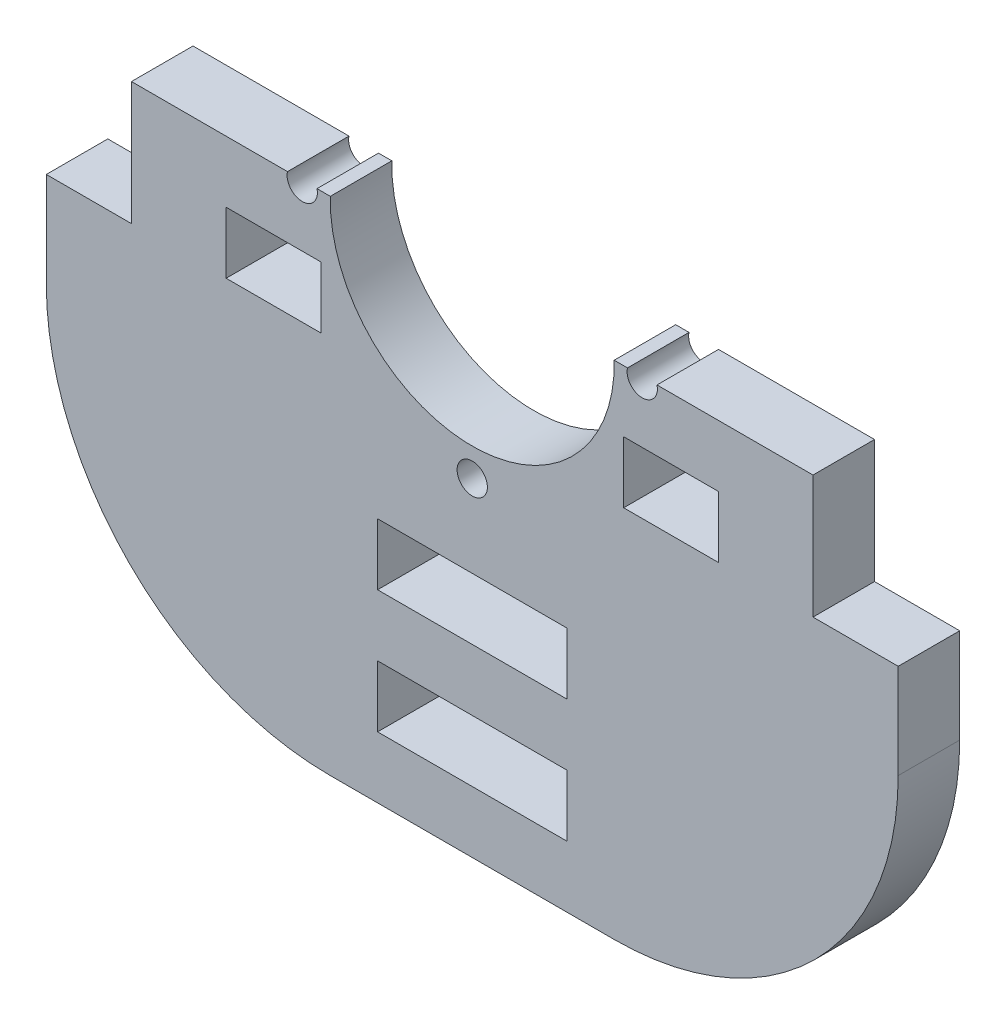
ISO-10303-21;
HEADER;
FILE_DESCRIPTION(('STEP AP214'),'2;1');
FILE_NAME('part.step','',(''),(''),'','','');
FILE_SCHEMA(('AUTOMOTIVE_DESIGN { 1 0 10303 214 1 1 1 1 }'));
ENDSEC;
DATA;
#1=APPLICATION_CONTEXT('core data for automotive mechanical design processes');
#2=APPLICATION_PROTOCOL_DEFINITION('international standard','automotive_design',2000,#1);
#3=PRODUCT_CONTEXT('',#1,'mechanical');
#4=PRODUCT('Part','Part','',(#3));
#5=PRODUCT_RELATED_PRODUCT_CATEGORY('part','',(#4));
#6=PRODUCT_DEFINITION_FORMATION('','',#4);
#7=PRODUCT_DEFINITION_CONTEXT('part definition',#1,'design');
#8=PRODUCT_DEFINITION('design','',#6,#7);
#9=PRODUCT_DEFINITION_SHAPE('','',#8);
#10=(LENGTH_UNIT() NAMED_UNIT(*) SI_UNIT(.MILLI.,.METRE.));
#11=(NAMED_UNIT(*) PLANE_ANGLE_UNIT() SI_UNIT($,.RADIAN.));
#12=(NAMED_UNIT(*) SI_UNIT($,.STERADIAN.) SOLID_ANGLE_UNIT());
#13=UNCERTAINTY_MEASURE_WITH_UNIT(LENGTH_MEASURE(1.E-05),#10,'distance_accuracy_value','');
#14=(GEOMETRIC_REPRESENTATION_CONTEXT(3) GLOBAL_UNCERTAINTY_ASSIGNED_CONTEXT((#13)) GLOBAL_UNIT_ASSIGNED_CONTEXT((#10,
#11,#12)) REPRESENTATION_CONTEXT('',''));
#15=CARTESIAN_POINT('',(0.,0.,0.));
#16=DIRECTION('',(0.,0.,1.));
#17=DIRECTION('',(1.,0.,0.));
#18=AXIS2_PLACEMENT_3D('',#15,#16,#17);
#19=CARTESIAN_POINT('',(0.,53.,6.5));
#20=DIRECTION('',(0.,1.,0.));
#21=DIRECTION('',(0.,0.,1.));
#22=AXIS2_PLACEMENT_3D('',#19,#20,#21);
#23=PLANE('',#22);
#24=DIRECTION('',(0.,0.,1.));
#25=VECTOR('',#24,1.);
#26=CARTESIAN_POINT('',(25.4806708667845,53.,0.));
#27=LINE('',#26,#25);
#28=CARTESIAN_POINT('',(25.4806708667845,53.,0.));
#29=VERTEX_POINT('',#28);
#30=CARTESIAN_POINT('',(25.4806708667845,53.,6.5));
#31=VERTEX_POINT('',#30);
#32=EDGE_CURVE('E386',#29,#31,#27,.T.);
#33=ORIENTED_EDGE('',*,*,#32,.F.);
#34=DIRECTION('',(1.,0.,0.));
#35=VECTOR('',#34,1.);
#36=CARTESIAN_POINT('',(0.,53.,0.));
#37=LINE('',#36,#35);
#38=CARTESIAN_POINT('',(9.,53.,0.));
#39=VERTEX_POINT('',#38);
#40=EDGE_CURVE('E442',#39,#29,#37,.T.);
#41=ORIENTED_EDGE('',*,*,#40,.F.);
#42=DIRECTION('',(0.,0.,-1.));
#43=VECTOR('',#42,1.);
#44=CARTESIAN_POINT('',(9.,53.,6.5));
#45=LINE('',#44,#43);
#46=CARTESIAN_POINT('',(9.,53.,6.5));
#47=VERTEX_POINT('',#46);
#48=EDGE_CURVE('E470',#47,#39,#45,.T.);
#49=ORIENTED_EDGE('',*,*,#48,.F.);
#50=DIRECTION('',(1.,0.,0.));
#51=VECTOR('',#50,1.);
#52=CARTESIAN_POINT('',(0.,53.,6.5));
#53=LINE('',#52,#51);
#54=EDGE_CURVE('E421',#47,#31,#53,.T.);
#55=ORIENTED_EDGE('',*,*,#54,.T.);
#56=EDGE_LOOP('',(#33,#41,#49,#55));
#57=FACE_BOUND('',#56,.T.);
#58=ADVANCED_FACE('F44',(#57),#23,.T.);
#59=DIRECTION('',(0.,0.,1.));
#60=VECTOR('',#59,1.);
#61=CARTESIAN_POINT('',(61.4016953510612,53.,0.));
#62=LINE('',#61,#60);
#63=CARTESIAN_POINT('',(61.4016953510612,53.,0.));
#64=VERTEX_POINT('',#63);
#65=CARTESIAN_POINT('',(61.4016953510612,53.,6.5));
#66=VERTEX_POINT('',#65);
#67=EDGE_CURVE('E395',#64,#66,#62,.T.);
#68=ORIENTED_EDGE('',*,*,#67,.F.);
#69=CARTESIAN_POINT('',(59.9956630430237,53.,0.));
#70=VERTEX_POINT('',#69);
#71=EDGE_CURVE('E447',#70,#64,#37,.T.);
#72=ORIENTED_EDGE('',*,*,#71,.F.);
#73=DIRECTION('',(0.,0.,1.));
#74=VECTOR('',#73,1.);
#75=CARTESIAN_POINT('',(59.9956630430237,53.,0.));
#76=LINE('',#75,#74);
#77=CARTESIAN_POINT('',(59.9956630430237,53.,6.5));
#78=VERTEX_POINT('',#77);
#79=EDGE_CURVE('E410',#70,#78,#76,.T.);
#80=ORIENTED_EDGE('',*,*,#79,.T.);
#81=EDGE_CURVE('E426',#78,#66,#53,.T.);
#82=ORIENTED_EDGE('',*,*,#81,.T.);
#83=EDGE_LOOP('',(#68,#72,#80,#82));
#84=FACE_BOUND('',#83,.T.);
#85=ADVANCED_FACE('F549',(#84),#23,.T.);
#86=DIRECTION('',(0.,0.,1.));
#87=VECTOR('',#86,1.);
#88=CARTESIAN_POINT('',(28.5983046489389,53.,0.));
#89=LINE('',#88,#87);
#90=CARTESIAN_POINT('',(28.5983046489389,53.,6.5));
#91=VERTEX_POINT('',#90);
#92=CARTESIAN_POINT('',(28.5983046489389,53.,0.));
#93=VERTEX_POINT('',#92);
#94=EDGE_CURVE('E384',#91,#93,#89,.F.);
#95=ORIENTED_EDGE('',*,*,#94,.F.);
#96=CARTESIAN_POINT('',(30.0043369569763,53.,6.5));
#97=VERTEX_POINT('',#96);
#98=EDGE_CURVE('E425',#91,#97,#53,.T.);
#99=ORIENTED_EDGE('',*,*,#98,.T.);
#100=DIRECTION('',(0.,0.,1.));
#101=VECTOR('',#100,1.);
#102=CARTESIAN_POINT('',(30.0043369569763,53.,0.));
#103=LINE('',#102,#101);
#104=CARTESIAN_POINT('',(30.0043369569763,53.,0.));
#105=VERTEX_POINT('',#104);
#106=EDGE_CURVE('E408',#105,#97,#103,.T.);
#107=ORIENTED_EDGE('',*,*,#106,.F.);
#108=EDGE_CURVE('E446',#93,#105,#37,.T.);
#109=ORIENTED_EDGE('',*,*,#108,.F.);
#110=EDGE_LOOP('',(#95,#99,#107,#109));
#111=FACE_BOUND('',#110,.T.);
#112=ADVANCED_FACE('F540',(#111),#23,.T.);
#113=CARTESIAN_POINT('',(81.0000000000001,1.7293858652815E-13,6.5));
#114=DIRECTION('',(1.,0.,0.));
#115=DIRECTION('',(0.,1.,0.));
#116=AXIS2_PLACEMENT_3D('',#113,#114,#115);
#117=PLANE('',#116);
#118=DIRECTION('',(0.,-1.,0.));
#119=VECTOR('',#118,1.);
#120=CARTESIAN_POINT('',(81.0000000000001,1.7293858652815E-13,0.));
#121=LINE('',#120,#119);
#122=CARTESIAN_POINT('',(81.,53.,0.));
#123=VERTEX_POINT('',#122);
#124=CARTESIAN_POINT('',(81.,40.,0.));
#125=VERTEX_POINT('',#124);
#126=EDGE_CURVE('E413',#123,#125,#121,.T.);
#127=ORIENTED_EDGE('',*,*,#126,.F.);
#128=DIRECTION('',(0.,0.,-1.));
#129=VECTOR('',#128,1.);
#130=CARTESIAN_POINT('',(81.,53.,6.5));
#131=LINE('',#130,#129);
#132=CARTESIAN_POINT('',(81.,53.,6.5));
#133=VERTEX_POINT('',#132);
#134=EDGE_CURVE('E472',#133,#123,#131,.T.);
#135=ORIENTED_EDGE('',*,*,#134,.F.);
#136=DIRECTION('',(0.,-1.,0.));
#137=VECTOR('',#136,1.);
#138=CARTESIAN_POINT('',(81.0000000000001,1.7293858652815E-13,6.5));
#139=LINE('',#138,#137);
#140=CARTESIAN_POINT('',(81.,40.,6.5));
#141=VERTEX_POINT('',#140);
#142=EDGE_CURVE('E416',#133,#141,#139,.T.);
#143=ORIENTED_EDGE('',*,*,#142,.T.);
#144=DIRECTION('',(0.,0.,-1.));
#145=VECTOR('',#144,1.);
#146=CARTESIAN_POINT('',(81.,40.,6.5));
#147=LINE('',#146,#145);
#148=EDGE_CURVE('E460',#141,#125,#147,.T.);
#149=ORIENTED_EDGE('',*,*,#148,.T.);
#150=EDGE_LOOP('',(#127,#135,#143,#149));
#151=FACE_BOUND('',#150,.T.);
#152=ADVANCED_FACE('F530',(#151),#117,.T.);
#153=DIRECTION('',(0.,0.,1.));
#154=VECTOR('',#153,1.);
#155=CARTESIAN_POINT('',(64.5193291332155,53.,0.));
#156=LINE('',#155,#154);
#157=CARTESIAN_POINT('',(64.5193291332155,53.,0.));
#158=VERTEX_POINT('',#157);
#159=CARTESIAN_POINT('',(64.5193291332155,53.,6.5));
#160=VERTEX_POINT('',#159);
#161=EDGE_CURVE('E392',#158,#160,#156,.T.);
#162=ORIENTED_EDGE('',*,*,#161,.T.);
#163=EDGE_CURVE('E419',#160,#133,#53,.T.);
#164=ORIENTED_EDGE('',*,*,#163,.T.);
#165=ORIENTED_EDGE('',*,*,#134,.T.);
#166=EDGE_CURVE('E441',#158,#123,#37,.T.);
#167=ORIENTED_EDGE('',*,*,#166,.F.);
#168=EDGE_LOOP('',(#162,#164,#165,#167));
#169=FACE_BOUND('',#168,.T.);
#170=ADVANCED_FACE('F533',(#169),#23,.T.);
#171=CARTESIAN_POINT('',(9.,0.,6.5));
#172=DIRECTION('',(1.,0.,0.));
#173=DIRECTION('',(0.,1.,0.));
#174=AXIS2_PLACEMENT_3D('',#171,#172,#173);
#175=PLANE('',#174);
#176=DIRECTION('',(0.,-1.,0.));
#177=VECTOR('',#176,1.);
#178=CARTESIAN_POINT('',(9.,0.,0.));
#179=LINE('',#178,#177);
#180=CARTESIAN_POINT('',(9.,40.,0.));
#181=VERTEX_POINT('',#180);
#182=EDGE_CURVE('E445',#39,#181,#179,.T.);
#183=ORIENTED_EDGE('',*,*,#182,.T.);
#184=DIRECTION('',(0.,0.,-1.));
#185=VECTOR('',#184,1.);
#186=CARTESIAN_POINT('',(9.,40.,6.5));
#187=LINE('',#186,#185);
#188=CARTESIAN_POINT('',(9.,40.,6.5));
#189=VERTEX_POINT('',#188);
#190=EDGE_CURVE('E468',#189,#181,#187,.T.);
#191=ORIENTED_EDGE('',*,*,#190,.F.);
#192=DIRECTION('',(0.,-1.,0.));
#193=VECTOR('',#192,1.);
#194=CARTESIAN_POINT('',(9.,0.,6.5));
#195=LINE('',#194,#193);
#196=EDGE_CURVE('E424',#47,#189,#195,.T.);
#197=ORIENTED_EDGE('',*,*,#196,.F.);
#198=ORIENTED_EDGE('',*,*,#48,.T.);
#199=EDGE_LOOP('',(#183,#191,#197,#198));
#200=FACE_BOUND('',#199,.T.);
#201=ADVANCED_FACE('F575',(#200),#175,.F.);
#202=CARTESIAN_POINT('',(0.,40.,6.5));
#203=DIRECTION('',(0.,1.,0.));
#204=DIRECTION('',(0.,0.,1.));
#205=AXIS2_PLACEMENT_3D('',#202,#203,#204);
#206=PLANE('',#205);
#207=DIRECTION('',(1.,0.,0.));
#208=VECTOR('',#207,1.);
#209=CARTESIAN_POINT('',(0.,40.,0.));
#210=LINE('',#209,#208);
#211=CARTESIAN_POINT('',(0.,40.,0.));
#212=VERTEX_POINT('',#211);
#213=EDGE_CURVE('E450',#212,#181,#210,.T.);
#214=ORIENTED_EDGE('',*,*,#213,.F.);
#215=DIRECTION('',(0.,0.,-1.));
#216=VECTOR('',#215,1.);
#217=CARTESIAN_POINT('',(0.,40.,6.5));
#218=LINE('',#217,#216);
#219=CARTESIAN_POINT('',(0.,40.,6.5));
#220=VERTEX_POINT('',#219);
#221=EDGE_CURVE('E465',#220,#212,#218,.T.);
#222=ORIENTED_EDGE('',*,*,#221,.F.);
#223=DIRECTION('',(1.,0.,0.));
#224=VECTOR('',#223,1.);
#225=CARTESIAN_POINT('',(0.,40.,6.5));
#226=LINE('',#225,#224);
#227=EDGE_CURVE('E428',#220,#189,#226,.T.);
#228=ORIENTED_EDGE('',*,*,#227,.T.);
#229=ORIENTED_EDGE('',*,*,#190,.T.);
#230=EDGE_LOOP('',(#214,#222,#228,#229));
#231=FACE_BOUND('',#230,.T.);
#232=ADVANCED_FACE('F580',(#231),#206,.T.);
#233=CARTESIAN_POINT('',(0.,0.,6.5));
#234=DIRECTION('',(-1.,0.,0.));
#235=DIRECTION('',(0.,0.,1.));
#236=AXIS2_PLACEMENT_3D('',#233,#234,#235);
#237=PLANE('',#236);
#238=DIRECTION('',(0.,1.,0.));
#239=VECTOR('',#238,1.);
#240=CARTESIAN_POINT('',(0.,0.,0.));
#241=LINE('',#240,#239);
#242=CARTESIAN_POINT('',(0.,30.,0.));
#243=VERTEX_POINT('',#242);
#244=EDGE_CURVE('E453',#243,#212,#241,.T.);
#245=ORIENTED_EDGE('',*,*,#244,.F.);
#246=DIRECTION('',(0.,0.,-1.));
#247=VECTOR('',#246,1.);
#248=CARTESIAN_POINT('',(0.,30.,6.5));
#249=LINE('',#248,#247);
#250=CARTESIAN_POINT('',(0.,30.,6.5));
#251=VERTEX_POINT('',#250);
#252=EDGE_CURVE('E52',#243,#251,#249,.F.);
#253=ORIENTED_EDGE('',*,*,#252,.T.);
#254=DIRECTION('',(0.,1.,0.));
#255=VECTOR('',#254,1.);
#256=CARTESIAN_POINT('',(0.,0.,6.5));
#257=LINE('',#256,#255);
#258=EDGE_CURVE('E431',#251,#220,#257,.T.);
#259=ORIENTED_EDGE('',*,*,#258,.T.);
#260=ORIENTED_EDGE('',*,*,#221,.T.);
#261=EDGE_LOOP('',(#245,#253,#259,#260));
#262=FACE_BOUND('',#261,.T.);
#263=ADVANCED_FACE('F494',(#262),#237,.T.);
#264=CARTESIAN_POINT('',(0.,0.,6.5));
#265=DIRECTION('',(0.,1.,0.));
#266=DIRECTION('',(0.,0.,1.));
#267=AXIS2_PLACEMENT_3D('',#264,#265,#266);
#268=PLANE('',#267);
#269=DIRECTION('',(1.,0.,0.));
#270=VECTOR('',#269,1.);
#271=CARTESIAN_POINT('',(0.,0.,0.));
#272=LINE('',#271,#270);
#273=CARTESIAN_POINT('',(30.,0.,0.));
#274=VERTEX_POINT('',#273);
#275=CARTESIAN_POINT('',(60.,0.,0.));
#276=VERTEX_POINT('',#275);
#277=EDGE_CURVE('E455',#274,#276,#272,.T.);
#278=ORIENTED_EDGE('',*,*,#277,.T.);
#279=DIRECTION('',(0.,0.,-1.));
#280=VECTOR('',#279,1.);
#281=CARTESIAN_POINT('',(60.,0.,6.5));
#282=LINE('',#281,#280);
#283=CARTESIAN_POINT('',(60.,0.,6.5));
#284=VERTEX_POINT('',#283);
#285=EDGE_CURVE('E485',#276,#284,#282,.F.);
#286=ORIENTED_EDGE('',*,*,#285,.T.);
#287=DIRECTION('',(1.,0.,0.));
#288=VECTOR('',#287,1.);
#289=CARTESIAN_POINT('',(0.,0.,6.5));
#290=LINE('',#289,#288);
#291=CARTESIAN_POINT('',(30.,0.,6.5));
#292=VERTEX_POINT('',#291);
#293=EDGE_CURVE('E434',#292,#284,#290,.T.);
#294=ORIENTED_EDGE('',*,*,#293,.F.);
#295=DIRECTION('',(0.,0.,-1.));
#296=VECTOR('',#295,1.);
#297=CARTESIAN_POINT('',(30.,0.,0.));
#298=LINE('',#297,#296);
#299=EDGE_CURVE('E482',#292,#274,#298,.T.);
#300=ORIENTED_EDGE('',*,*,#299,.T.);
#301=EDGE_LOOP('',(#278,#286,#294,#300));
#302=FACE_BOUND('',#301,.T.);
#303=ADVANCED_FACE('F507',(#302),#268,.F.);
#304=CARTESIAN_POINT('',(90.,0.,6.5));
#305=DIRECTION('',(-1.,0.,0.));
#306=DIRECTION('',(0.,0.,1.));
#307=AXIS2_PLACEMENT_3D('',#304,#305,#306);
#308=PLANE('',#307);
#309=DIRECTION('',(0.,1.,0.));
#310=VECTOR('',#309,1.);
#311=CARTESIAN_POINT('',(90.,0.,6.5));
#312=LINE('',#311,#310);
#313=CARTESIAN_POINT('',(90.,30.,6.5));
#314=VERTEX_POINT('',#313);
#315=CARTESIAN_POINT('',(90.,40.,6.5));
#316=VERTEX_POINT('',#315);
#317=EDGE_CURVE('E437',#314,#316,#312,.T.);
#318=ORIENTED_EDGE('',*,*,#317,.F.);
#319=DIRECTION('',(0.,0.,-1.));
#320=VECTOR('',#319,1.);
#321=CARTESIAN_POINT('',(90.,30.,6.5));
#322=LINE('',#321,#320);
#323=CARTESIAN_POINT('',(90.,30.,0.));
#324=VERTEX_POINT('',#323);
#325=EDGE_CURVE('E475',#314,#324,#322,.T.);
#326=ORIENTED_EDGE('',*,*,#325,.T.);
#327=DIRECTION('',(0.,1.,0.));
#328=VECTOR('',#327,1.);
#329=CARTESIAN_POINT('',(90.,0.,0.));
#330=LINE('',#329,#328);
#331=CARTESIAN_POINT('',(90.,40.,0.));
#332=VERTEX_POINT('',#331);
#333=EDGE_CURVE('E458',#324,#332,#330,.T.);
#334=ORIENTED_EDGE('',*,*,#333,.T.);
#335=DIRECTION('',(0.,0.,-1.));
#336=VECTOR('',#335,1.);
#337=CARTESIAN_POINT('',(90.,40.,6.5));
#338=LINE('',#337,#336);
#339=EDGE_CURVE('E462',#316,#332,#338,.T.);
#340=ORIENTED_EDGE('',*,*,#339,.F.);
#341=EDGE_LOOP('',(#318,#326,#334,#340));
#342=FACE_BOUND('',#341,.T.);
#343=ADVANCED_FACE('F518',(#342),#308,.F.);
#344=EDGE_CURVE('E420',#125,#332,#210,.T.);
#345=ORIENTED_EDGE('',*,*,#344,.F.);
#346=ORIENTED_EDGE('',*,*,#148,.F.);
#347=EDGE_CURVE('E432',#141,#316,#226,.T.);
#348=ORIENTED_EDGE('',*,*,#347,.T.);
#349=ORIENTED_EDGE('',*,*,#339,.T.);
#350=EDGE_LOOP('',(#345,#346,#348,#349));
#351=FACE_BOUND('',#350,.T.);
#352=ADVANCED_FACE('F526',(#351),#206,.T.);
#353=CARTESIAN_POINT('',(0.,0.,6.5));
#354=DIRECTION('',(0.,0.,1.));
#355=DIRECTION('',(1.,0.,0.));
#356=AXIS2_PLACEMENT_3D('',#353,#354,#355);
#357=PLANE('',#356);
#358=DIRECTION('',(0.,-1.,0.));
#359=VECTOR('',#358,1.);
#360=CARTESIAN_POINT('',(35.,6.5,6.5));
#361=LINE('',#360,#359);
#362=CARTESIAN_POINT('',(35.,13.,6.5));
#363=VERTEX_POINT('',#362);
#364=CARTESIAN_POINT('',(35.,6.5,6.5));
#365=VERTEX_POINT('',#364);
#366=EDGE_CURVE('E59',#363,#365,#361,.T.);
#367=ORIENTED_EDGE('',*,*,#366,.F.);
#368=DIRECTION('',(-1.,0.,0.));
#369=VECTOR('',#368,1.);
#370=CARTESIAN_POINT('',(35.,13.,6.5));
#371=LINE('',#370,#369);
#372=CARTESIAN_POINT('',(55.,13.,6.5));
#373=VERTEX_POINT('',#372);
#374=EDGE_CURVE('E261',#373,#363,#371,.T.);
#375=ORIENTED_EDGE('',*,*,#374,.F.);
#376=DIRECTION('',(0.,1.,0.));
#377=VECTOR('',#376,1.);
#378=CARTESIAN_POINT('',(55.,6.50000000000001,6.5));
#379=LINE('',#378,#377);
#380=CARTESIAN_POINT('',(55.,6.50000000000001,6.5));
#381=VERTEX_POINT('',#380);
#382=EDGE_CURVE('E281',#381,#373,#379,.T.);
#383=ORIENTED_EDGE('',*,*,#382,.F.);
#384=DIRECTION('',(1.,0.,0.));
#385=VECTOR('',#384,1.);
#386=CARTESIAN_POINT('',(35.,6.5,6.5));
#387=LINE('',#386,#385);
#388=EDGE_CURVE('E275',#365,#381,#387,.T.);
#389=ORIENTED_EDGE('',*,*,#388,.F.);
#390=EDGE_LOOP('',(#367,#375,#383,#389));
#391=FACE_BOUND('',#390,.T.);
#392=DIRECTION('',(0.,-1.,0.));
#393=VECTOR('',#392,1.);
#394=CARTESIAN_POINT('',(35.,19.5,6.5));
#395=LINE('',#394,#393);
#396=CARTESIAN_POINT('',(35.,26.,6.5));
#397=VERTEX_POINT('',#396);
#398=CARTESIAN_POINT('',(35.,19.5,6.5));
#399=VERTEX_POINT('',#398);
#400=EDGE_CURVE('E297',#397,#399,#395,.T.);
#401=ORIENTED_EDGE('',*,*,#400,.F.);
#402=DIRECTION('',(-1.,0.,0.));
#403=VECTOR('',#402,1.);
#404=CARTESIAN_POINT('',(35.,26.,6.5));
#405=LINE('',#404,#403);
#406=CARTESIAN_POINT('',(55.,26.,6.5));
#407=VERTEX_POINT('',#406);
#408=EDGE_CURVE('E305',#407,#397,#405,.T.);
#409=ORIENTED_EDGE('',*,*,#408,.F.);
#410=DIRECTION('',(0.,1.,0.));
#411=VECTOR('',#410,1.);
#412=CARTESIAN_POINT('',(55.,19.5,6.5));
#413=LINE('',#412,#411);
#414=CARTESIAN_POINT('',(55.,19.5,6.5));
#415=VERTEX_POINT('',#414);
#416=EDGE_CURVE('E302',#415,#407,#413,.T.);
#417=ORIENTED_EDGE('',*,*,#416,.F.);
#418=DIRECTION('',(1.,0.,0.));
#419=VECTOR('',#418,1.);
#420=CARTESIAN_POINT('',(35.,19.5,6.5));
#421=LINE('',#420,#419);
#422=EDGE_CURVE('E299',#399,#415,#421,.T.);
#423=ORIENTED_EDGE('',*,*,#422,.F.);
#424=EDGE_LOOP('',(#401,#409,#417,#423));
#425=FACE_BOUND('',#424,.T.);
#426=DIRECTION('',(0.,1.,0.));
#427=VECTOR('',#426,1.);
#428=CARTESIAN_POINT('',(71.,40.,6.5));
#429=LINE('',#428,#427);
#430=CARTESIAN_POINT('',(71.,40.,6.5));
#431=VERTEX_POINT('',#430);
#432=CARTESIAN_POINT('',(71.,46.5,6.5));
#433=VERTEX_POINT('',#432);
#434=EDGE_CURVE('E328',#431,#433,#429,.T.);
#435=ORIENTED_EDGE('',*,*,#434,.F.);
#436=DIRECTION('',(1.,0.,0.));
#437=VECTOR('',#436,1.);
#438=CARTESIAN_POINT('',(71.,40.,6.5));
#439=LINE('',#438,#437);
#440=CARTESIAN_POINT('',(61.,40.,6.5));
#441=VERTEX_POINT('',#440);
#442=EDGE_CURVE('E336',#441,#431,#439,.T.);
#443=ORIENTED_EDGE('',*,*,#442,.F.);
#444=DIRECTION('',(0.,-1.,0.));
#445=VECTOR('',#444,1.);
#446=CARTESIAN_POINT('',(61.,40.,6.5));
#447=LINE('',#446,#445);
#448=CARTESIAN_POINT('',(61.,46.5,6.5));
#449=VERTEX_POINT('',#448);
#450=EDGE_CURVE('E333',#449,#441,#447,.T.);
#451=ORIENTED_EDGE('',*,*,#450,.F.);
#452=DIRECTION('',(-1.,0.,0.));
#453=VECTOR('',#452,1.);
#454=CARTESIAN_POINT('',(71.,46.5,6.5));
#455=LINE('',#454,#453);
#456=EDGE_CURVE('E330',#433,#449,#455,.T.);
#457=ORIENTED_EDGE('',*,*,#456,.F.);
#458=EDGE_LOOP('',(#435,#443,#451,#457));
#459=FACE_BOUND('',#458,.T.);
#460=DIRECTION('',(0.,-1.,0.));
#461=VECTOR('',#460,1.);
#462=CARTESIAN_POINT('',(19.,40.,6.5));
#463=LINE('',#462,#461);
#464=CARTESIAN_POINT('',(19.,46.5,6.5));
#465=VERTEX_POINT('',#464);
#466=CARTESIAN_POINT('',(19.,40.,6.5));
#467=VERTEX_POINT('',#466);
#468=EDGE_CURVE('E359',#465,#467,#463,.T.);
#469=ORIENTED_EDGE('',*,*,#468,.F.);
#470=DIRECTION('',(-1.,0.,0.));
#471=VECTOR('',#470,1.);
#472=CARTESIAN_POINT('',(19.,46.5,6.5));
#473=LINE('',#472,#471);
#474=CARTESIAN_POINT('',(29.,46.5,6.5));
#475=VERTEX_POINT('',#474);
#476=EDGE_CURVE('E367',#475,#465,#473,.T.);
#477=ORIENTED_EDGE('',*,*,#476,.F.);
#478=DIRECTION('',(0.,1.,0.));
#479=VECTOR('',#478,1.);
#480=CARTESIAN_POINT('',(29.,40.,6.5));
#481=LINE('',#480,#479);
#482=CARTESIAN_POINT('',(29.,40.,6.5));
#483=VERTEX_POINT('',#482);
#484=EDGE_CURVE('E364',#483,#475,#481,.T.);
#485=ORIENTED_EDGE('',*,*,#484,.F.);
#486=DIRECTION('',(1.,0.,0.));
#487=VECTOR('',#486,1.);
#488=CARTESIAN_POINT('',(19.,40.,6.5));
#489=LINE('',#488,#487);
#490=EDGE_CURVE('E361',#467,#483,#489,.T.);
#491=ORIENTED_EDGE('',*,*,#490,.F.);
#492=EDGE_LOOP('',(#469,#477,#485,#491));
#493=FACE_BOUND('',#492,.T.);
#494=CARTESIAN_POINT('',(27.0394877578617,52.6393202250021,6.5));
#495=DIRECTION('',(0.,0.,1.));
#496=DIRECTION('',(1.,0.,0.));
#497=AXIS2_PLACEMENT_3D('',#494,#495,#496);
#498=CIRCLE('',#497,1.60000000000001);
#499=EDGE_CURVE('E382',#31,#91,#498,.T.);
#500=ORIENTED_EDGE('',*,*,#499,.F.);
#501=ORIENTED_EDGE('',*,*,#54,.F.);
#502=ORIENTED_EDGE('',*,*,#196,.T.);
#503=ORIENTED_EDGE('',*,*,#227,.F.);
#504=ORIENTED_EDGE('',*,*,#258,.F.);
#505=CARTESIAN_POINT('',(30.,30.,6.5));
#506=DIRECTION('',(0.,0.,1.));
#507=DIRECTION('',(1.,0.,0.));
#508=AXIS2_PLACEMENT_3D('',#505,#506,#507);
#509=CIRCLE('',#508,30.);
#510=EDGE_CURVE('E487',#251,#292,#509,.T.);
#511=ORIENTED_EDGE('',*,*,#510,.T.);
#512=ORIENTED_EDGE('',*,*,#293,.T.);
#513=CARTESIAN_POINT('',(60.,30.,6.5));
#514=DIRECTION('',(0.,0.,1.));
#515=DIRECTION('',(1.,0.,0.));
#516=AXIS2_PLACEMENT_3D('',#513,#514,#515);
#517=CIRCLE('',#516,30.);
#518=EDGE_CURVE('E489',#284,#314,#517,.T.);
#519=ORIENTED_EDGE('',*,*,#518,.T.);
#520=ORIENTED_EDGE('',*,*,#317,.T.);
#521=ORIENTED_EDGE('',*,*,#347,.F.);
#522=ORIENTED_EDGE('',*,*,#142,.F.);
#523=ORIENTED_EDGE('',*,*,#163,.F.);
#524=CARTESIAN_POINT('',(62.9605122421383,52.6393202250021,6.5));
#525=DIRECTION('',(0.,0.,1.));
#526=DIRECTION('',(1.,0.,0.));
#527=AXIS2_PLACEMENT_3D('',#524,#525,#526);
#528=CIRCLE('',#527,1.59999999999999);
#529=EDGE_CURVE('E400',#66,#160,#528,.T.);
#530=ORIENTED_EDGE('',*,*,#529,.F.);
#531=ORIENTED_EDGE('',*,*,#81,.F.);
#532=CARTESIAN_POINT('',(45.,52.6393202250021,6.5));
#533=DIRECTION('',(0.,0.,1.));
#534=DIRECTION('',(1.,0.,0.));
#535=AXIS2_PLACEMENT_3D('',#532,#533,#534);
#536=CIRCLE('',#535,15.);
#537=EDGE_CURVE('E402',#97,#78,#536,.T.);
#538=ORIENTED_EDGE('',*,*,#537,.F.);
#539=ORIENTED_EDGE('',*,*,#98,.F.);
#540=EDGE_LOOP('',(#500,#501,#502,#503,#504,#511,#512,#519,#520,#521,#522,#523,#530,#531,#538,#539));
#541=FACE_BOUND('',#540,.T.);
#542=CARTESIAN_POINT('',(45.,34.6788079828638,6.5));
#543=DIRECTION('',(0.,0.,1.));
#544=DIRECTION('',(1.,0.,0.));
#545=AXIS2_PLACEMENT_3D('',#542,#543,#544);
#546=CIRCLE('',#545,1.60000000000001);
#547=CARTESIAN_POINT('',(46.6,34.6788079828638,6.5));
#548=VERTEX_POINT('',#547);
#549=EDGE_CURVE('E389',#548,#548,#546,.T.);
#550=ORIENTED_EDGE('',*,*,#549,.F.);
#551=EDGE_LOOP('',(#550));
#552=FACE_BOUND('',#551,.T.);
#553=ADVANCED_FACE('F501',(#391,#425,#459,#493,#541,#552),#357,.T.);
#554=CARTESIAN_POINT('',(0.,0.,0.));
#555=DIRECTION('',(0.,0.,1.));
#556=DIRECTION('',(1.,0.,0.));
#557=AXIS2_PLACEMENT_3D('',#554,#555,#556);
#558=PLANE('',#557);
#559=DIRECTION('',(1.,0.,0.));
#560=VECTOR('',#559,1.);
#561=CARTESIAN_POINT('',(35.,13.,0.));
#562=LINE('',#561,#560);
#563=CARTESIAN_POINT('',(35.,13.,0.));
#564=VERTEX_POINT('',#563);
#565=CARTESIAN_POINT('',(55.,13.,0.));
#566=VERTEX_POINT('',#565);
#567=EDGE_CURVE('E273',#564,#566,#562,.T.);
#568=ORIENTED_EDGE('',*,*,#567,.F.);
#569=DIRECTION('',(0.,1.,0.));
#570=VECTOR('',#569,1.);
#571=CARTESIAN_POINT('',(35.,6.5,0.));
#572=LINE('',#571,#570);
#573=CARTESIAN_POINT('',(35.,6.5,0.));
#574=VERTEX_POINT('',#573);
#575=EDGE_CURVE('E255',#574,#564,#572,.T.);
#576=ORIENTED_EDGE('',*,*,#575,.F.);
#577=DIRECTION('',(-1.,0.,0.));
#578=VECTOR('',#577,1.);
#579=CARTESIAN_POINT('',(35.,6.5,0.));
#580=LINE('',#579,#578);
#581=CARTESIAN_POINT('',(55.,6.50000000000001,0.));
#582=VERTEX_POINT('',#581);
#583=EDGE_CURVE('E264',#582,#574,#580,.T.);
#584=ORIENTED_EDGE('',*,*,#583,.F.);
#585=DIRECTION('',(0.,-1.,0.));
#586=VECTOR('',#585,1.);
#587=CARTESIAN_POINT('',(55.,6.50000000000001,0.));
#588=LINE('',#587,#586);
#589=EDGE_CURVE('E67',#566,#582,#588,.T.);
#590=ORIENTED_EDGE('',*,*,#589,.F.);
#591=EDGE_LOOP('',(#568,#576,#584,#590));
#592=FACE_BOUND('',#591,.T.);
#593=DIRECTION('',(1.,0.,0.));
#594=VECTOR('',#593,1.);
#595=CARTESIAN_POINT('',(35.,26.,0.));
#596=LINE('',#595,#594);
#597=CARTESIAN_POINT('',(35.,26.,0.));
#598=VERTEX_POINT('',#597);
#599=CARTESIAN_POINT('',(55.,26.,0.));
#600=VERTEX_POINT('',#599);
#601=EDGE_CURVE('E291',#598,#600,#596,.T.);
#602=ORIENTED_EDGE('',*,*,#601,.F.);
#603=DIRECTION('',(0.,1.,0.));
#604=VECTOR('',#603,1.);
#605=CARTESIAN_POINT('',(35.,19.5,0.));
#606=LINE('',#605,#604);
#607=CARTESIAN_POINT('',(35.,19.5,0.));
#608=VERTEX_POINT('',#607);
#609=EDGE_CURVE('E294',#608,#598,#606,.T.);
#610=ORIENTED_EDGE('',*,*,#609,.F.);
#611=DIRECTION('',(-1.,0.,0.));
#612=VECTOR('',#611,1.);
#613=CARTESIAN_POINT('',(35.,19.5,0.));
#614=LINE('',#613,#612);
#615=CARTESIAN_POINT('',(55.,19.5,0.));
#616=VERTEX_POINT('',#615);
#617=EDGE_CURVE('E311',#616,#608,#614,.T.);
#618=ORIENTED_EDGE('',*,*,#617,.F.);
#619=DIRECTION('',(0.,-1.,0.));
#620=VECTOR('',#619,1.);
#621=CARTESIAN_POINT('',(55.,19.5,0.));
#622=LINE('',#621,#620);
#623=EDGE_CURVE('E267',#600,#616,#622,.T.);
#624=ORIENTED_EDGE('',*,*,#623,.F.);
#625=EDGE_LOOP('',(#602,#610,#618,#624));
#626=FACE_BOUND('',#625,.T.);
#627=DIRECTION('',(-1.,0.,0.));
#628=VECTOR('',#627,1.);
#629=CARTESIAN_POINT('',(71.,40.,0.));
#630=LINE('',#629,#628);
#631=CARTESIAN_POINT('',(71.,40.,0.));
#632=VERTEX_POINT('',#631);
#633=CARTESIAN_POINT('',(61.,40.,0.));
#634=VERTEX_POINT('',#633);
#635=EDGE_CURVE('E322',#632,#634,#630,.T.);
#636=ORIENTED_EDGE('',*,*,#635,.F.);
#637=DIRECTION('',(0.,-1.,0.));
#638=VECTOR('',#637,1.);
#639=CARTESIAN_POINT('',(71.,40.,0.));
#640=LINE('',#639,#638);
#641=CARTESIAN_POINT('',(71.,46.5,0.));
#642=VERTEX_POINT('',#641);
#643=EDGE_CURVE('E325',#642,#632,#640,.T.);
#644=ORIENTED_EDGE('',*,*,#643,.F.);
#645=DIRECTION('',(1.,0.,0.));
#646=VECTOR('',#645,1.);
#647=CARTESIAN_POINT('',(71.,46.5,0.));
#648=LINE('',#647,#646);
#649=CARTESIAN_POINT('',(61.,46.5,0.));
#650=VERTEX_POINT('',#649);
#651=EDGE_CURVE('E342',#650,#642,#648,.T.);
#652=ORIENTED_EDGE('',*,*,#651,.F.);
#653=DIRECTION('',(0.,1.,0.));
#654=VECTOR('',#653,1.);
#655=CARTESIAN_POINT('',(61.,40.,0.));
#656=LINE('',#655,#654);
#657=EDGE_CURVE('E320',#634,#650,#656,.T.);
#658=ORIENTED_EDGE('',*,*,#657,.F.);
#659=EDGE_LOOP('',(#636,#644,#652,#658));
#660=FACE_BOUND('',#659,.T.);
#661=DIRECTION('',(1.,0.,0.));
#662=VECTOR('',#661,1.);
#663=CARTESIAN_POINT('',(19.,46.5,0.));
#664=LINE('',#663,#662);
#665=CARTESIAN_POINT('',(19.,46.5,0.));
#666=VERTEX_POINT('',#665);
#667=CARTESIAN_POINT('',(29.,46.5,0.));
#668=VERTEX_POINT('',#667);
#669=EDGE_CURVE('E353',#666,#668,#664,.T.);
#670=ORIENTED_EDGE('',*,*,#669,.F.);
#671=DIRECTION('',(0.,1.,0.));
#672=VECTOR('',#671,1.);
#673=CARTESIAN_POINT('',(19.,40.,0.));
#674=LINE('',#673,#672);
#675=CARTESIAN_POINT('',(19.,40.,0.));
#676=VERTEX_POINT('',#675);
#677=EDGE_CURVE('E356',#676,#666,#674,.T.);
#678=ORIENTED_EDGE('',*,*,#677,.F.);
#679=DIRECTION('',(-1.,0.,0.));
#680=VECTOR('',#679,1.);
#681=CARTESIAN_POINT('',(19.,40.,0.));
#682=LINE('',#681,#680);
#683=CARTESIAN_POINT('',(29.,40.,0.));
#684=VERTEX_POINT('',#683);
#685=EDGE_CURVE('E373',#684,#676,#682,.T.);
#686=ORIENTED_EDGE('',*,*,#685,.F.);
#687=DIRECTION('',(0.,-1.,0.));
#688=VECTOR('',#687,1.);
#689=CARTESIAN_POINT('',(29.,40.,0.));
#690=LINE('',#689,#688);
#691=EDGE_CURVE('E351',#668,#684,#690,.T.);
#692=ORIENTED_EDGE('',*,*,#691,.F.);
#693=EDGE_LOOP('',(#670,#678,#686,#692));
#694=FACE_BOUND('',#693,.T.);
#695=CARTESIAN_POINT('',(45.,34.6788079828638,0.));
#696=DIRECTION('',(0.,0.,1.));
#697=DIRECTION('',(1.,0.,0.));
#698=AXIS2_PLACEMENT_3D('',#695,#696,#697);
#699=CIRCLE('',#698,1.60000000000001);
#700=CARTESIAN_POINT('',(46.6,34.6788079828638,0.));
#701=VERTEX_POINT('',#700);
#702=EDGE_CURVE('E388',#701,#701,#699,.T.);
#703=ORIENTED_EDGE('',*,*,#702,.T.);
#704=EDGE_LOOP('',(#703));
#705=FACE_BOUND('',#704,.T.);
#706=ORIENTED_EDGE('',*,*,#40,.T.);
#707=CARTESIAN_POINT('',(27.0394877578617,52.6393202250021,0.));
#708=DIRECTION('',(0.,0.,1.));
#709=DIRECTION('',(1.,0.,0.));
#710=AXIS2_PLACEMENT_3D('',#707,#708,#709);
#711=CIRCLE('',#710,1.60000000000001);
#712=EDGE_CURVE('E12',#29,#93,#711,.T.);
#713=ORIENTED_EDGE('',*,*,#712,.T.);
#714=ORIENTED_EDGE('',*,*,#108,.T.);
#715=CARTESIAN_POINT('',(45.,52.6393202250021,0.));
#716=DIRECTION('',(0.,0.,1.));
#717=DIRECTION('',(1.,0.,0.));
#718=AXIS2_PLACEMENT_3D('',#715,#716,#717);
#719=CIRCLE('',#718,15.);
#720=EDGE_CURVE('E405',#105,#70,#719,.T.);
#721=ORIENTED_EDGE('',*,*,#720,.T.);
#722=ORIENTED_EDGE('',*,*,#71,.T.);
#723=CARTESIAN_POINT('',(62.9605122421383,52.6393202250021,0.));
#724=DIRECTION('',(0.,0.,1.));
#725=DIRECTION('',(1.,0.,0.));
#726=AXIS2_PLACEMENT_3D('',#723,#724,#725);
#727=CIRCLE('',#726,1.59999999999999);
#728=EDGE_CURVE('E397',#64,#158,#727,.T.);
#729=ORIENTED_EDGE('',*,*,#728,.T.);
#730=ORIENTED_EDGE('',*,*,#166,.T.);
#731=ORIENTED_EDGE('',*,*,#126,.T.);
#732=ORIENTED_EDGE('',*,*,#344,.T.);
#733=ORIENTED_EDGE('',*,*,#333,.F.);
#734=CARTESIAN_POINT('',(60.,30.,0.));
#735=DIRECTION('',(0.,0.,1.));
#736=DIRECTION('',(1.,0.,0.));
#737=AXIS2_PLACEMENT_3D('',#734,#735,#736);
#738=CIRCLE('',#737,30.);
#739=EDGE_CURVE('E480',#324,#276,#738,.F.);
#740=ORIENTED_EDGE('',*,*,#739,.T.);
#741=ORIENTED_EDGE('',*,*,#277,.F.);
#742=CARTESIAN_POINT('',(30.,30.,0.));
#743=DIRECTION('',(0.,0.,1.));
#744=DIRECTION('',(1.,0.,0.));
#745=AXIS2_PLACEMENT_3D('',#742,#743,#744);
#746=CIRCLE('',#745,30.);
#747=EDGE_CURVE('E478',#274,#243,#746,.F.);
#748=ORIENTED_EDGE('',*,*,#747,.T.);
#749=ORIENTED_EDGE('',*,*,#244,.T.);
#750=ORIENTED_EDGE('',*,*,#213,.T.);
#751=ORIENTED_EDGE('',*,*,#182,.F.);
#752=EDGE_LOOP('',(#706,#713,#714,#721,#722,#729,#730,#731,#732,#733,#740,#741,#748,#749,#750,#751));
#753=FACE_BOUND('',#752,.T.);
#754=ADVANCED_FACE('F270',(#592,#626,#660,#694,#705,#753),#558,.F.);
#755=CARTESIAN_POINT('',(60.,30.,6.5));
#756=DIRECTION('',(0.,0.,-1.));
#757=DIRECTION('',(-1.,0.,0.));
#758=AXIS2_PLACEMENT_3D('',#755,#756,#757);
#759=CYLINDRICAL_SURFACE('',#758,30.);
#760=ORIENTED_EDGE('',*,*,#518,.F.);
#761=ORIENTED_EDGE('',*,*,#285,.F.);
#762=ORIENTED_EDGE('',*,*,#739,.F.);
#763=ORIENTED_EDGE('',*,*,#325,.F.);
#764=EDGE_LOOP('',(#760,#761,#762,#763));
#765=FACE_BOUND('',#764,.T.);
#766=ADVANCED_FACE('F515',(#765),#759,.T.);
#767=CARTESIAN_POINT('',(30.,30.,6.5));
#768=DIRECTION('',(0.,0.,1.));
#769=DIRECTION('',(1.,0.,0.));
#770=AXIS2_PLACEMENT_3D('',#767,#768,#769);
#771=CYLINDRICAL_SURFACE('',#770,30.);
#772=ORIENTED_EDGE('',*,*,#510,.F.);
#773=ORIENTED_EDGE('',*,*,#252,.F.);
#774=ORIENTED_EDGE('',*,*,#747,.F.);
#775=ORIENTED_EDGE('',*,*,#299,.F.);
#776=EDGE_LOOP('',(#772,#773,#774,#775));
#777=FACE_BOUND('',#776,.T.);
#778=ADVANCED_FACE('F46',(#777),#771,.T.);
#779=CARTESIAN_POINT('',(45.,52.6393202250021,0.));
#780=DIRECTION('',(0.,0.,1.));
#781=DIRECTION('',(1.,0.,0.));
#782=AXIS2_PLACEMENT_3D('',#779,#780,#781);
#783=CYLINDRICAL_SURFACE('',#782,15.);
#784=ORIENTED_EDGE('',*,*,#537,.T.);
#785=ORIENTED_EDGE('',*,*,#79,.F.);
#786=ORIENTED_EDGE('',*,*,#720,.F.);
#787=ORIENTED_EDGE('',*,*,#106,.T.);
#788=EDGE_LOOP('',(#784,#785,#786,#787));
#789=FACE_BOUND('',#788,.T.);
#790=ADVANCED_FACE('F545',(#789),#783,.F.);
#791=CARTESIAN_POINT('',(62.9605122421383,52.6393202250021,0.));
#792=DIRECTION('',(0.,0.,1.));
#793=DIRECTION('',(1.,0.,0.));
#794=AXIS2_PLACEMENT_3D('',#791,#792,#793);
#795=CYLINDRICAL_SURFACE('',#794,1.59999999999999);
#796=ORIENTED_EDGE('',*,*,#529,.T.);
#797=ORIENTED_EDGE('',*,*,#161,.F.);
#798=ORIENTED_EDGE('',*,*,#728,.F.);
#799=ORIENTED_EDGE('',*,*,#67,.T.);
#800=EDGE_LOOP('',(#796,#797,#798,#799));
#801=FACE_BOUND('',#800,.T.);
#802=ADVANCED_FACE('F553',(#801),#795,.F.);
#803=CARTESIAN_POINT('',(45.,34.6788079828638,0.));
#804=DIRECTION('',(0.,0.,1.));
#805=DIRECTION('',(1.,0.,0.));
#806=AXIS2_PLACEMENT_3D('',#803,#804,#805);
#807=CYLINDRICAL_SURFACE('',#806,1.60000000000001);
#808=CARTESIAN_POINT('',(46.6,34.6788079828638,0.));
#809=CARTESIAN_POINT('',(46.6,34.6788079828638,0.0677083333333332));
#810=CARTESIAN_POINT('',(46.6,34.6788079828638,0.135416666666667));
#811=CARTESIAN_POINT('',(46.6,34.6788079828638,0.270833333333333));
#812=CARTESIAN_POINT('',(46.6,34.6788079828638,0.338541666666667));
#813=CARTESIAN_POINT('',(46.6,34.6788079828638,0.473958333333333));
#814=CARTESIAN_POINT('',(46.6,34.6788079828638,0.541666666666667));
#815=CARTESIAN_POINT('',(46.6,34.6788079828638,0.677083333333333));
#816=CARTESIAN_POINT('',(46.6,34.6788079828638,0.744791666666667));
#817=CARTESIAN_POINT('',(46.6,34.6788079828638,0.880208333333333));
#818=CARTESIAN_POINT('',(46.6,34.6788079828638,0.947916666666667));
#819=CARTESIAN_POINT('',(46.6,34.6788079828638,1.08333333333333));
#820=CARTESIAN_POINT('',(46.6,34.6788079828638,1.15104166666667));
#821=CARTESIAN_POINT('',(46.6,34.6788079828638,1.28645833333333));
#822=CARTESIAN_POINT('',(46.6,34.6788079828638,1.35416666666667));
#823=CARTESIAN_POINT('',(46.6,34.6788079828638,1.48958333333333));
#824=CARTESIAN_POINT('',(46.6,34.6788079828638,1.55729166666667));
#825=CARTESIAN_POINT('',(46.6,34.6788079828638,1.69270833333333));
#826=CARTESIAN_POINT('',(46.6,34.6788079828638,1.76041666666667));
#827=CARTESIAN_POINT('',(46.6,34.6788079828638,1.89583333333333));
#828=CARTESIAN_POINT('',(46.6,34.6788079828638,1.96354166666667));
#829=CARTESIAN_POINT('',(46.6,34.6788079828638,2.09895833333333));
#830=CARTESIAN_POINT('',(46.6,34.6788079828638,2.16666666666667));
#831=CARTESIAN_POINT('',(46.6,34.6788079828638,2.30208333333333));
#832=CARTESIAN_POINT('',(46.6,34.6788079828638,2.36979166666667));
#833=CARTESIAN_POINT('',(46.6,34.6788079828638,2.50520833333333));
#834=CARTESIAN_POINT('',(46.6,34.6788079828638,2.57291666666667));
#835=CARTESIAN_POINT('',(46.6,34.6788079828638,2.70833333333333));
#836=CARTESIAN_POINT('',(46.6,34.6788079828638,2.77604166666667));
#837=CARTESIAN_POINT('',(46.6,34.6788079828638,2.91145833333333));
#838=CARTESIAN_POINT('',(46.6,34.6788079828638,2.97916666666667));
#839=CARTESIAN_POINT('',(46.6,34.6788079828638,3.11458333333333));
#840=CARTESIAN_POINT('',(46.6,34.6788079828638,3.18229166666667));
#841=CARTESIAN_POINT('',(46.6,34.6788079828638,3.31770833333333));
#842=CARTESIAN_POINT('',(46.6,34.6788079828638,3.38541666666667));
#843=CARTESIAN_POINT('',(46.6,34.6788079828638,3.52083333333333));
#844=CARTESIAN_POINT('',(46.6,34.6788079828638,3.58854166666667));
#845=CARTESIAN_POINT('',(46.6,34.6788079828638,3.72395833333333));
#846=CARTESIAN_POINT('',(46.6,34.6788079828638,3.79166666666667));
#847=CARTESIAN_POINT('',(46.6,34.6788079828638,3.92708333333333));
#848=CARTESIAN_POINT('',(46.6,34.6788079828638,3.99479166666667));
#849=CARTESIAN_POINT('',(46.6,34.6788079828638,4.13020833333333));
#850=CARTESIAN_POINT('',(46.6,34.6788079828638,4.19791666666667));
#851=CARTESIAN_POINT('',(46.6,34.6788079828638,4.33333333333333));
#852=CARTESIAN_POINT('',(46.6,34.6788079828638,4.40104166666667));
#853=CARTESIAN_POINT('',(46.6,34.6788079828638,4.53645833333333));
#854=CARTESIAN_POINT('',(46.6,34.6788079828638,4.60416666666667));
#855=CARTESIAN_POINT('',(46.6,34.6788079828638,4.73958333333333));
#856=CARTESIAN_POINT('',(46.6,34.6788079828638,4.80729166666667));
#857=CARTESIAN_POINT('',(46.6,34.6788079828638,4.94270833333333));
#858=CARTESIAN_POINT('',(46.6,34.6788079828638,5.01041666666667));
#859=CARTESIAN_POINT('',(46.6,34.6788079828638,5.14583333333333));
#860=CARTESIAN_POINT('',(46.6,34.6788079828638,5.21354166666667));
#861=CARTESIAN_POINT('',(46.6,34.6788079828638,5.34895833333333));
#862=CARTESIAN_POINT('',(46.6,34.6788079828638,5.41666666666667));
#863=CARTESIAN_POINT('',(46.6,34.6788079828638,5.55208333333333));
#864=CARTESIAN_POINT('',(46.6,34.6788079828638,5.61979166666667));
#865=CARTESIAN_POINT('',(46.6,34.6788079828638,5.75520833333333));
#866=CARTESIAN_POINT('',(46.6,34.6788079828638,5.82291666666667));
#867=CARTESIAN_POINT('',(46.6,34.6788079828638,5.95833333333333));
#868=CARTESIAN_POINT('',(46.6,34.6788079828638,6.02604166666667));
#869=CARTESIAN_POINT('',(46.6,34.6788079828638,6.16145833333333));
#870=CARTESIAN_POINT('',(46.6,34.6788079828638,6.22916666666667));
#871=CARTESIAN_POINT('',(46.6,34.6788079828638,6.36458333333333));
#872=CARTESIAN_POINT('',(46.6,34.6788079828638,6.43229166666667));
#873=CARTESIAN_POINT('',(46.6,34.6788079828638,6.5));
#874=B_SPLINE_CURVE_WITH_KNOTS('',3,(#808,#809,#810,#811,#812,#813,#814,#815,#816,#817,#818,
#819,#820,#821,#822,#823,#824,#825,#826,#827,#828,#829,#830,#831,#832,#833,#834,#835,#836,#837,
#838,#839,#840,#841,#842,#843,#844,#845,#846,#847,#848,#849,#850,#851,#852,#853,#854,#855,#856,
#857,#858,#859,#860,#861,#862,#863,#864,#865,#866,#867,#868,#869,#870,#871,#872,#873),
.UNSPECIFIED.,.F.,.F.,(4,2,2,2,2,2,2,2,2,2,2,2,2,2,2,2,2,2,2,2,2,2,2,2,2,2,2,2,2,2,2,2,4),(0.,
0.203125,0.40625,0.609375,0.8125,1.015625,1.21875,1.421875,1.625,1.828125,2.03125,2.234375,
2.4375,2.640625,2.84375,3.046875,3.25,3.453125,3.65625,3.859375,4.0625,4.265625,4.46875,
4.671875,4.875,5.078125,5.28125,5.484375,5.6875,5.890625,6.09375,6.296875,6.5),.UNSPECIFIED.);
#875=EDGE_CURVE('BSEAM555',#701,#548,#874,.T.);
#876=ORIENTED_EDGE('',*,*,#702,.F.);
#877=ORIENTED_EDGE('',*,*,#549,.T.);
#878=ORIENTED_EDGE('',*,*,#875,.T.);
#879=ORIENTED_EDGE('',*,*,#875,.F.);
#880=EDGE_LOOP('',(#876,#878,#877,#879));
#881=FACE_BOUND('',#880,.T.);
#882=ADVANCED_FACE('F555',(#881),#807,.F.);
#883=CARTESIAN_POINT('',(27.0394877578617,52.6393202250021,0.));
#884=DIRECTION('',(0.,0.,1.));
#885=DIRECTION('',(1.,0.,0.));
#886=AXIS2_PLACEMENT_3D('',#883,#884,#885);
#887=CYLINDRICAL_SURFACE('',#886,1.60000000000001);
#888=ORIENTED_EDGE('',*,*,#32,.T.);
#889=ORIENTED_EDGE('',*,*,#499,.T.);
#890=ORIENTED_EDGE('',*,*,#94,.T.);
#891=ORIENTED_EDGE('',*,*,#712,.F.);
#892=EDGE_LOOP('',(#888,#889,#890,#891));
#893=FACE_BOUND('',#892,.T.);
#894=ADVANCED_FACE('F561',(#893),#887,.F.);
#895=CARTESIAN_POINT('',(19.,40.,-0.00100000000000013));
#896=DIRECTION('',(-1.,0.,0.));
#897=DIRECTION('',(0.,0.,1.));
#898=AXIS2_PLACEMENT_3D('',#895,#896,#897);
#899=PLANE('',#898);
#900=ORIENTED_EDGE('',*,*,#677,.T.);
#901=DIRECTION('',(0.,0.,1.));
#902=VECTOR('',#901,1.);
#903=CARTESIAN_POINT('',(19.,46.5,-0.00100000000000013));
#904=LINE('',#903,#902);
#905=EDGE_CURVE('E371',#666,#465,#904,.T.);
#906=ORIENTED_EDGE('',*,*,#905,.T.);
#907=ORIENTED_EDGE('',*,*,#468,.T.);
#908=DIRECTION('',(0.,0.,1.));
#909=VECTOR('',#908,1.);
#910=CARTESIAN_POINT('',(19.,40.,-0.00100000000000013));
#911=LINE('',#910,#909);
#912=EDGE_CURVE('E370',#676,#467,#911,.T.);
#913=ORIENTED_EDGE('',*,*,#912,.F.);
#914=EDGE_LOOP('',(#900,#906,#907,#913));
#915=FACE_BOUND('',#914,.T.);
#916=ADVANCED_FACE('F692',(#915),#899,.F.);
#917=CARTESIAN_POINT('',(19.,46.5,-0.00100000000000013));
#918=DIRECTION('',(0.,1.,0.));
#919=DIRECTION('',(0.,0.,1.));
#920=AXIS2_PLACEMENT_3D('',#917,#918,#919);
#921=PLANE('',#920);
#922=ORIENTED_EDGE('',*,*,#669,.T.);
#923=DIRECTION('',(0.,0.,1.));
#924=VECTOR('',#923,1.);
#925=CARTESIAN_POINT('',(29.,46.5,-0.00100000000000013));
#926=LINE('',#925,#924);
#927=EDGE_CURVE('E374',#668,#475,#926,.T.);
#928=ORIENTED_EDGE('',*,*,#927,.T.);
#929=ORIENTED_EDGE('',*,*,#476,.T.);
#930=ORIENTED_EDGE('',*,*,#905,.F.);
#931=EDGE_LOOP('',(#922,#928,#929,#930));
#932=FACE_BOUND('',#931,.T.);
#933=ADVANCED_FACE('F704',(#932),#921,.F.);
#934=CARTESIAN_POINT('',(29.,40.,-0.00100000000000013));
#935=DIRECTION('',(1.,0.,0.));
#936=DIRECTION('',(0.,0.,-1.));
#937=AXIS2_PLACEMENT_3D('',#934,#935,#936);
#938=PLANE('',#937);
#939=ORIENTED_EDGE('',*,*,#691,.T.);
#940=DIRECTION('',(0.,0.,1.));
#941=VECTOR('',#940,1.);
#942=CARTESIAN_POINT('',(29.,40.,-0.00100000000000013));
#943=LINE('',#942,#941);
#944=EDGE_CURVE('E376',#684,#483,#943,.T.);
#945=ORIENTED_EDGE('',*,*,#944,.T.);
#946=ORIENTED_EDGE('',*,*,#484,.T.);
#947=ORIENTED_EDGE('',*,*,#927,.F.);
#948=EDGE_LOOP('',(#939,#945,#946,#947));
#949=FACE_BOUND('',#948,.T.);
#950=ADVANCED_FACE('F713',(#949),#938,.F.);
#951=CARTESIAN_POINT('',(19.,40.,-0.00100000000000013));
#952=DIRECTION('',(0.,-1.,0.));
#953=DIRECTION('',(0.,0.,-1.));
#954=AXIS2_PLACEMENT_3D('',#951,#952,#953);
#955=PLANE('',#954);
#956=ORIENTED_EDGE('',*,*,#685,.T.);
#957=ORIENTED_EDGE('',*,*,#912,.T.);
#958=ORIENTED_EDGE('',*,*,#490,.T.);
#959=ORIENTED_EDGE('',*,*,#944,.F.);
#960=EDGE_LOOP('',(#956,#957,#958,#959));
#961=FACE_BOUND('',#960,.T.);
#962=ADVANCED_FACE('F722',(#961),#955,.F.);
#963=CARTESIAN_POINT('',(71.,40.,-0.00100000000000013));
#964=DIRECTION('',(1.,0.,0.));
#965=DIRECTION('',(0.,0.,-1.));
#966=AXIS2_PLACEMENT_3D('',#963,#964,#965);
#967=PLANE('',#966);
#968=ORIENTED_EDGE('',*,*,#643,.T.);
#969=DIRECTION('',(0.,0.,1.));
#970=VECTOR('',#969,1.);
#971=CARTESIAN_POINT('',(71.,40.,-0.00100000000000013));
#972=LINE('',#971,#970);
#973=EDGE_CURVE('E340',#632,#431,#972,.T.);
#974=ORIENTED_EDGE('',*,*,#973,.T.);
#975=ORIENTED_EDGE('',*,*,#434,.T.);
#976=DIRECTION('',(0.,0.,1.));
#977=VECTOR('',#976,1.);
#978=CARTESIAN_POINT('',(71.,46.5,-0.00100000000000013));
#979=LINE('',#978,#977);
#980=EDGE_CURVE('E339',#642,#433,#979,.T.);
#981=ORIENTED_EDGE('',*,*,#980,.F.);
#982=EDGE_LOOP('',(#968,#974,#975,#981));
#983=FACE_BOUND('',#982,.T.);
#984=ADVANCED_FACE('F731',(#983),#967,.F.);
#985=CARTESIAN_POINT('',(71.,40.,-0.00100000000000013));
#986=DIRECTION('',(0.,-1.,0.));
#987=DIRECTION('',(0.,0.,-1.));
#988=AXIS2_PLACEMENT_3D('',#985,#986,#987);
#989=PLANE('',#988);
#990=ORIENTED_EDGE('',*,*,#635,.T.);
#991=DIRECTION('',(0.,0.,1.));
#992=VECTOR('',#991,1.);
#993=CARTESIAN_POINT('',(61.,40.,-0.00100000000000013));
#994=LINE('',#993,#992);
#995=EDGE_CURVE('E343',#634,#441,#994,.T.);
#996=ORIENTED_EDGE('',*,*,#995,.T.);
#997=ORIENTED_EDGE('',*,*,#442,.T.);
#998=ORIENTED_EDGE('',*,*,#973,.F.);
#999=EDGE_LOOP('',(#990,#996,#997,#998));
#1000=FACE_BOUND('',#999,.T.);
#1001=ADVANCED_FACE('F740',(#1000),#989,.F.);
#1002=CARTESIAN_POINT('',(61.,40.,-0.00100000000000013));
#1003=DIRECTION('',(-1.,0.,0.));
#1004=DIRECTION('',(0.,-1.,0.));
#1005=AXIS2_PLACEMENT_3D('',#1002,#1003,#1004);
#1006=PLANE('',#1005);
#1007=ORIENTED_EDGE('',*,*,#657,.T.);
#1008=DIRECTION('',(0.,0.,1.));
#1009=VECTOR('',#1008,1.);
#1010=CARTESIAN_POINT('',(61.,46.5,-0.00100000000000013));
#1011=LINE('',#1010,#1009);
#1012=EDGE_CURVE('E345',#650,#449,#1011,.T.);
#1013=ORIENTED_EDGE('',*,*,#1012,.T.);
#1014=ORIENTED_EDGE('',*,*,#450,.T.);
#1015=ORIENTED_EDGE('',*,*,#995,.F.);
#1016=EDGE_LOOP('',(#1007,#1013,#1014,#1015));
#1017=FACE_BOUND('',#1016,.T.);
#1018=ADVANCED_FACE('F749',(#1017),#1006,.F.);
#1019=CARTESIAN_POINT('',(71.,46.5,-0.00100000000000013));
#1020=DIRECTION('',(0.,1.,0.));
#1021=DIRECTION('',(0.,0.,1.));
#1022=AXIS2_PLACEMENT_3D('',#1019,#1020,#1021);
#1023=PLANE('',#1022);
#1024=ORIENTED_EDGE('',*,*,#651,.T.);
#1025=ORIENTED_EDGE('',*,*,#980,.T.);
#1026=ORIENTED_EDGE('',*,*,#456,.T.);
#1027=ORIENTED_EDGE('',*,*,#1012,.F.);
#1028=EDGE_LOOP('',(#1024,#1025,#1026,#1027));
#1029=FACE_BOUND('',#1028,.T.);
#1030=ADVANCED_FACE('F758',(#1029),#1023,.F.);
#1031=CARTESIAN_POINT('',(35.,19.5,-0.00100000000000013));
#1032=DIRECTION('',(-1.,0.,0.));
#1033=DIRECTION('',(0.,0.,1.));
#1034=AXIS2_PLACEMENT_3D('',#1031,#1032,#1033);
#1035=PLANE('',#1034);
#1036=ORIENTED_EDGE('',*,*,#609,.T.);
#1037=DIRECTION('',(0.,0.,1.));
#1038=VECTOR('',#1037,1.);
#1039=CARTESIAN_POINT('',(35.,26.,-0.00100000000000013));
#1040=LINE('',#1039,#1038);
#1041=EDGE_CURVE('E309',#598,#397,#1040,.T.);
#1042=ORIENTED_EDGE('',*,*,#1041,.T.);
#1043=ORIENTED_EDGE('',*,*,#400,.T.);
#1044=DIRECTION('',(0.,0.,1.));
#1045=VECTOR('',#1044,1.);
#1046=CARTESIAN_POINT('',(35.,19.5,-0.00100000000000013));
#1047=LINE('',#1046,#1045);
#1048=EDGE_CURVE('E308',#608,#399,#1047,.T.);
#1049=ORIENTED_EDGE('',*,*,#1048,.F.);
#1050=EDGE_LOOP('',(#1036,#1042,#1043,#1049));
#1051=FACE_BOUND('',#1050,.T.);
#1052=ADVANCED_FACE('F767',(#1051),#1035,.F.);
#1053=CARTESIAN_POINT('',(35.,26.,-0.00100000000000013));
#1054=DIRECTION('',(0.,1.,0.));
#1055=DIRECTION('',(0.,0.,1.));
#1056=AXIS2_PLACEMENT_3D('',#1053,#1054,#1055);
#1057=PLANE('',#1056);
#1058=ORIENTED_EDGE('',*,*,#601,.T.);
#1059=DIRECTION('',(0.,0.,1.));
#1060=VECTOR('',#1059,1.);
#1061=CARTESIAN_POINT('',(55.,26.,-0.00100000000000013));
#1062=LINE('',#1061,#1060);
#1063=EDGE_CURVE('E312',#600,#407,#1062,.T.);
#1064=ORIENTED_EDGE('',*,*,#1063,.T.);
#1065=ORIENTED_EDGE('',*,*,#408,.T.);
#1066=ORIENTED_EDGE('',*,*,#1041,.F.);
#1067=EDGE_LOOP('',(#1058,#1064,#1065,#1066));
#1068=FACE_BOUND('',#1067,.T.);
#1069=ADVANCED_FACE('F777',(#1068),#1057,.F.);
#1070=CARTESIAN_POINT('',(55.,19.5,-0.00100000000000013));
#1071=DIRECTION('',(1.,0.,0.));
#1072=DIRECTION('',(0.,0.,-1.));
#1073=AXIS2_PLACEMENT_3D('',#1070,#1071,#1072);
#1074=PLANE('',#1073);
#1075=ORIENTED_EDGE('',*,*,#623,.T.);
#1076=DIRECTION('',(0.,0.,1.));
#1077=VECTOR('',#1076,1.);
#1078=CARTESIAN_POINT('',(55.,19.5,-0.00100000000000013));
#1079=LINE('',#1078,#1077);
#1080=EDGE_CURVE('E314',#616,#415,#1079,.T.);
#1081=ORIENTED_EDGE('',*,*,#1080,.T.);
#1082=ORIENTED_EDGE('',*,*,#416,.T.);
#1083=ORIENTED_EDGE('',*,*,#1063,.F.);
#1084=EDGE_LOOP('',(#1075,#1081,#1082,#1083));
#1085=FACE_BOUND('',#1084,.T.);
#1086=ADVANCED_FACE('F787',(#1085),#1074,.F.);
#1087=CARTESIAN_POINT('',(35.,19.5,-0.00100000000000013));
#1088=DIRECTION('',(0.,-1.,0.));
#1089=DIRECTION('',(0.,0.,-1.));
#1090=AXIS2_PLACEMENT_3D('',#1087,#1088,#1089);
#1091=PLANE('',#1090);
#1092=ORIENTED_EDGE('',*,*,#617,.T.);
#1093=ORIENTED_EDGE('',*,*,#1048,.T.);
#1094=ORIENTED_EDGE('',*,*,#422,.T.);
#1095=ORIENTED_EDGE('',*,*,#1080,.F.);
#1096=EDGE_LOOP('',(#1092,#1093,#1094,#1095));
#1097=FACE_BOUND('',#1096,.T.);
#1098=ADVANCED_FACE('F796',(#1097),#1091,.F.);
#1099=CARTESIAN_POINT('',(35.,6.5,-0.00100000000000013));
#1100=DIRECTION('',(-1.,0.,0.));
#1101=DIRECTION('',(0.,0.,1.));
#1102=AXIS2_PLACEMENT_3D('',#1099,#1100,#1101);
#1103=PLANE('',#1102);
#1104=ORIENTED_EDGE('',*,*,#575,.T.);
#1105=DIRECTION('',(0.,0.,1.));
#1106=VECTOR('',#1105,1.);
#1107=CARTESIAN_POINT('',(35.,13.,-0.00100000000000013));
#1108=LINE('',#1107,#1106);
#1109=EDGE_CURVE('E268',#564,#363,#1108,.T.);
#1110=ORIENTED_EDGE('',*,*,#1109,.T.);
#1111=ORIENTED_EDGE('',*,*,#366,.T.);
#1112=DIRECTION('',(0.,0.,1.));
#1113=VECTOR('',#1112,1.);
#1114=CARTESIAN_POINT('',(35.,6.5,-0.00100000000000013));
#1115=LINE('',#1114,#1113);
#1116=EDGE_CURVE('E251',#574,#365,#1115,.T.);
#1117=ORIENTED_EDGE('',*,*,#1116,.F.);
#1118=EDGE_LOOP('',(#1104,#1110,#1111,#1117));
#1119=FACE_BOUND('',#1118,.T.);
#1120=ADVANCED_FACE('F253',(#1119),#1103,.F.);
#1121=CARTESIAN_POINT('',(35.,13.,-0.00100000000000013));
#1122=DIRECTION('',(0.,1.,0.));
#1123=DIRECTION('',(-1.,0.,0.));
#1124=AXIS2_PLACEMENT_3D('',#1121,#1122,#1123);
#1125=PLANE('',#1124);
#1126=ORIENTED_EDGE('',*,*,#567,.T.);
#1127=DIRECTION('',(0.,0.,1.));
#1128=VECTOR('',#1127,1.);
#1129=CARTESIAN_POINT('',(55.,13.,-0.00100000000000013));
#1130=LINE('',#1129,#1128);
#1131=EDGE_CURVE('E287',#566,#373,#1130,.T.);
#1132=ORIENTED_EDGE('',*,*,#1131,.T.);
#1133=ORIENTED_EDGE('',*,*,#374,.T.);
#1134=ORIENTED_EDGE('',*,*,#1109,.F.);
#1135=EDGE_LOOP('',(#1126,#1132,#1133,#1134));
#1136=FACE_BOUND('',#1135,.T.);
#1137=ADVANCED_FACE('F813',(#1136),#1125,.F.);
#1138=CARTESIAN_POINT('',(55.,6.50000000000001,-0.00100000000000013));
#1139=DIRECTION('',(1.,0.,0.));
#1140=DIRECTION('',(0.,1.,0.));
#1141=AXIS2_PLACEMENT_3D('',#1138,#1139,#1140);
#1142=PLANE('',#1141);
#1143=ORIENTED_EDGE('',*,*,#589,.T.);
#1144=DIRECTION('',(0.,0.,1.));
#1145=VECTOR('',#1144,1.);
#1146=CARTESIAN_POINT('',(55.,6.50000000000001,-0.00100000000000013));
#1147=LINE('',#1146,#1145);
#1148=EDGE_CURVE('E260',#582,#381,#1147,.T.);
#1149=ORIENTED_EDGE('',*,*,#1148,.T.);
#1150=ORIENTED_EDGE('',*,*,#382,.T.);
#1151=ORIENTED_EDGE('',*,*,#1131,.F.);
#1152=EDGE_LOOP('',(#1143,#1149,#1150,#1151));
#1153=FACE_BOUND('',#1152,.T.);
#1154=ADVANCED_FACE('F821',(#1153),#1142,.F.);
#1155=CARTESIAN_POINT('',(35.,6.5,-0.00100000000000013));
#1156=DIRECTION('',(0.,-1.,0.));
#1157=DIRECTION('',(1.,0.,0.));
#1158=AXIS2_PLACEMENT_3D('',#1155,#1156,#1157);
#1159=PLANE('',#1158);
#1160=ORIENTED_EDGE('',*,*,#583,.T.);
#1161=ORIENTED_EDGE('',*,*,#1116,.T.);
#1162=ORIENTED_EDGE('',*,*,#388,.T.);
#1163=ORIENTED_EDGE('',*,*,#1148,.F.);
#1164=EDGE_LOOP('',(#1160,#1161,#1162,#1163));
#1165=FACE_BOUND('',#1164,.T.);
#1166=ADVANCED_FACE('F265',(#1165),#1159,.F.);
#1167=CLOSED_SHELL('',(#58,#85,#112,#152,#170,#201,#232,#263,#303,#343,#352,#553,#754,#766,#778,
#790,#802,#882,#894,#916,#933,#950,#962,#984,#1001,#1018,#1030,#1052,#1069,#1086,#1098,#1120,
#1137,#1154,#1166));
#1168=MANIFOLD_SOLID_BREP('B2',#1167);
#1169=ADVANCED_BREP_SHAPE_REPRESENTATION('',(#18,#1168),#14);
#1170=SHAPE_DEFINITION_REPRESENTATION(#9,#1169);
ENDSEC;
END-ISO-10303-21;
